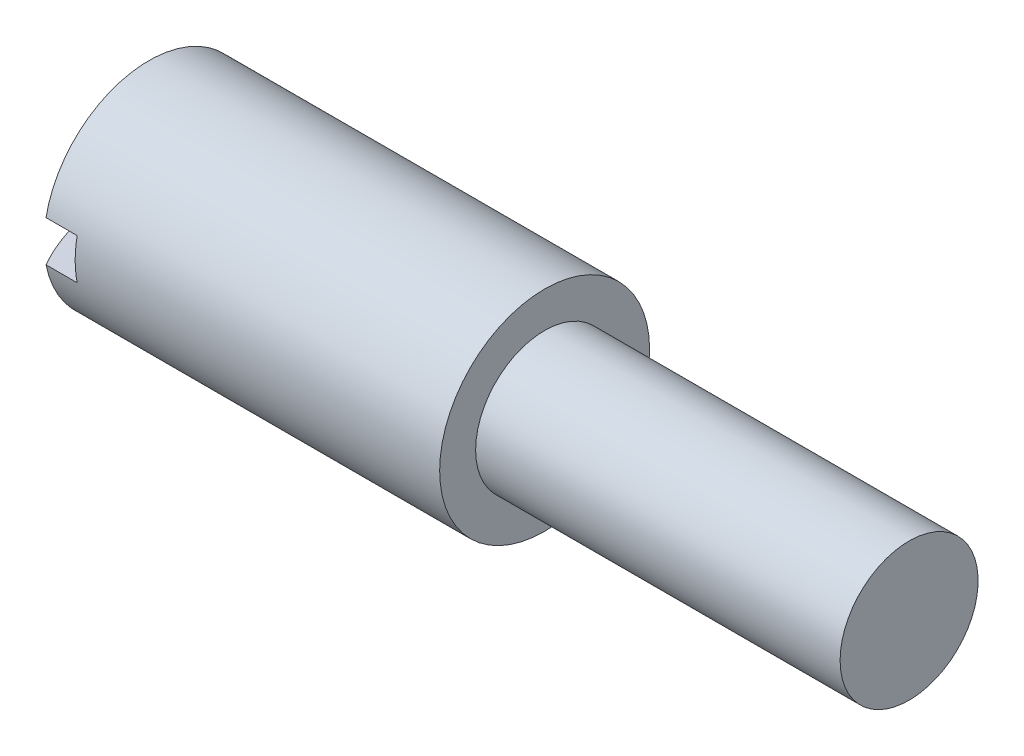
ISO-10303-21;
HEADER;
FILE_DESCRIPTION(('STEP AP214'),'2;1');
FILE_NAME('part.step','',(''),(''),'','','');
FILE_SCHEMA(('AUTOMOTIVE_DESIGN { 1 0 10303 214 1 1 1 1 }'));
ENDSEC;
DATA;
#1=APPLICATION_CONTEXT('core data for automotive mechanical design processes');
#2=APPLICATION_PROTOCOL_DEFINITION('international standard','automotive_design',2000,#1);
#3=PRODUCT_CONTEXT('',#1,'mechanical');
#4=PRODUCT('Part','Part','',(#3));
#5=PRODUCT_RELATED_PRODUCT_CATEGORY('part','',(#4));
#6=PRODUCT_DEFINITION_FORMATION('','',#4);
#7=PRODUCT_DEFINITION_CONTEXT('part definition',#1,'design');
#8=PRODUCT_DEFINITION('design','',#6,#7);
#9=PRODUCT_DEFINITION_SHAPE('','',#8);
#10=(LENGTH_UNIT() NAMED_UNIT(*) SI_UNIT(.MILLI.,.METRE.));
#11=(NAMED_UNIT(*) PLANE_ANGLE_UNIT() SI_UNIT($,.RADIAN.));
#12=(NAMED_UNIT(*) SI_UNIT($,.STERADIAN.) SOLID_ANGLE_UNIT());
#13=UNCERTAINTY_MEASURE_WITH_UNIT(LENGTH_MEASURE(1.E-05),#10,'distance_accuracy_value','');
#14=(GEOMETRIC_REPRESENTATION_CONTEXT(3) GLOBAL_UNCERTAINTY_ASSIGNED_CONTEXT((#13)) GLOBAL_UNIT_ASSIGNED_CONTEXT((#10,
#11,#12)) REPRESENTATION_CONTEXT('',''));
#15=CARTESIAN_POINT('',(0.,0.,0.));
#16=DIRECTION('',(0.,0.,1.));
#17=DIRECTION('',(1.,0.,0.));
#18=AXIS2_PLACEMENT_3D('',#15,#16,#17);
#19=CARTESIAN_POINT('',(5.4864,0.,0.));
#20=DIRECTION('',(-1.,0.,0.));
#21=DIRECTION('',(0.,1.,0.));
#22=AXIS2_PLACEMENT_3D('',#19,#20,#21);
#23=SPHERICAL_SURFACE('',#22,5.4864);
#24=CARTESIAN_POINT('',(5.4864,0.5334,0.));
#25=DIRECTION('',(0.,-1.,0.));
#26=DIRECTION('',(0.,0.,-1.));
#27=AXIS2_PLACEMENT_3D('',#24,#25,#26);
#28=CIRCLE('',#27,5.46040927037525);
#29=CARTESIAN_POINT('',(0.735038224677055,0.5334,2.69084200205066));
#30=VERTEX_POINT('',#29);
#31=CARTESIAN_POINT('',(0.735038224677055,0.5334,-2.69084200205066));
#32=VERTEX_POINT('',#31);
#33=EDGE_CURVE('E99',#30,#32,#28,.T.);
#34=ORIENTED_EDGE('',*,*,#33,.F.);
#35=CARTESIAN_POINT('',(0.735038224677055,0.,0.));
#36=DIRECTION('',(-1.,0.,0.));
#37=DIRECTION('',(0.,0.,1.));
#38=AXIS2_PLACEMENT_3D('',#35,#36,#37);
#39=CIRCLE('',#38,2.7432);
#40=EDGE_CURVE('E89',#30,#32,#39,.T.);
#41=ORIENTED_EDGE('',*,*,#40,.T.);
#42=EDGE_LOOP('',(#34,#41));
#43=FACE_BOUND('',#42,.T.);
#44=ADVANCED_FACE('F32',(#43),#23,.T.);
#45=CARTESIAN_POINT('',(5.4864,-0.5334,0.));
#46=DIRECTION('',(0.,1.,0.));
#47=DIRECTION('',(0.,0.,1.));
#48=AXIS2_PLACEMENT_3D('',#45,#46,#47);
#49=CIRCLE('',#48,5.46040927037525);
#50=CARTESIAN_POINT('',(0.735038224677055,-0.5334,-2.69084200205066));
#51=VERTEX_POINT('',#50);
#52=CARTESIAN_POINT('',(0.735038224677055,-0.5334,2.69084200205066));
#53=VERTEX_POINT('',#52);
#54=EDGE_CURVE('E101',#51,#53,#49,.T.);
#55=ORIENTED_EDGE('',*,*,#54,.F.);
#56=EDGE_CURVE('E96',#51,#53,#39,.T.);
#57=ORIENTED_EDGE('',*,*,#56,.T.);
#58=EDGE_LOOP('',(#55,#57));
#59=FACE_BOUND('',#58,.T.);
#60=ADVANCED_FACE('F114',(#59),#23,.T.);
#61=CARTESIAN_POINT('',(-12.7,0.,0.));
#62=DIRECTION('',(-1.,0.,0.));
#63=DIRECTION('',(0.,0.,1.));
#64=AXIS2_PLACEMENT_3D('',#61,#62,#63);
#65=CYLINDRICAL_SURFACE('',#64,2.7432);
#66=CARTESIAN_POINT('',(11.0744,0.,0.));
#67=DIRECTION('',(-1.,0.,0.));
#68=DIRECTION('',(0.,0.,1.));
#69=AXIS2_PLACEMENT_3D('',#66,#67,#68);
#70=CIRCLE('',#69,2.7432);
#71=CARTESIAN_POINT('',(11.0744,0.,2.7432));
#72=VERTEX_POINT('',#71);
#73=EDGE_CURVE('E35',#72,#72,#70,.F.);
#74=ORIENTED_EDGE('',*,*,#73,.F.);
#75=EDGE_LOOP('',(#74));
#76=FACE_BOUND('',#75,.T.);
#77=ORIENTED_EDGE('',*,*,#40,.F.);
#78=DIRECTION('',(-1.,0.,0.));
#79=VECTOR('',#78,1.);
#80=CARTESIAN_POINT('',(-12.7,0.5334,2.69084200205066));
#81=LINE('',#80,#79);
#82=CARTESIAN_POINT('',(1.5494,0.5334,2.69084200205066));
#83=VERTEX_POINT('',#82);
#84=EDGE_CURVE('E40',#30,#83,#81,.F.);
#85=ORIENTED_EDGE('',*,*,#84,.T.);
#86=CARTESIAN_POINT('',(1.5494,0.,0.));
#87=DIRECTION('',(1.,0.,0.));
#88=DIRECTION('',(0.,0.,-1.));
#89=AXIS2_PLACEMENT_3D('',#86,#87,#88);
#90=CIRCLE('',#89,2.7432);
#91=CARTESIAN_POINT('',(1.5494,-0.5334,2.69084200205066));
#92=VERTEX_POINT('',#91);
#93=EDGE_CURVE('E71',#92,#83,#90,.F.);
#94=ORIENTED_EDGE('',*,*,#93,.F.);
#95=DIRECTION('',(-1.,0.,0.));
#96=VECTOR('',#95,1.);
#97=CARTESIAN_POINT('',(-12.7,-0.5334,2.69084200205066));
#98=LINE('',#97,#96);
#99=EDGE_CURVE('E78',#92,#53,#98,.T.);
#100=ORIENTED_EDGE('',*,*,#99,.T.);
#101=ORIENTED_EDGE('',*,*,#56,.F.);
#102=DIRECTION('',(-1.,0.,0.));
#103=VECTOR('',#102,1.);
#104=CARTESIAN_POINT('',(-12.7,-0.5334,-2.69084200205066));
#105=LINE('',#104,#103);
#106=CARTESIAN_POINT('',(1.5494,-0.5334,-2.69084200205066));
#107=VERTEX_POINT('',#106);
#108=EDGE_CURVE('E93',#51,#107,#105,.F.);
#109=ORIENTED_EDGE('',*,*,#108,.T.);
#110=CARTESIAN_POINT('',(1.5494,0.5334,-2.69084200205066));
#111=VERTEX_POINT('',#110);
#112=EDGE_CURVE('E81',#111,#107,#90,.F.);
#113=ORIENTED_EDGE('',*,*,#112,.F.);
#114=DIRECTION('',(-1.,0.,0.));
#115=VECTOR('',#114,1.);
#116=CARTESIAN_POINT('',(-12.7,0.5334,-2.69084200205066));
#117=LINE('',#116,#115);
#118=EDGE_CURVE('E79',#111,#32,#117,.T.);
#119=ORIENTED_EDGE('',*,*,#118,.T.);
#120=EDGE_LOOP('',(#77,#85,#94,#100,#101,#109,#113,#119));
#121=FACE_BOUND('',#120,.T.);
#122=ADVANCED_FACE('F87',(#76,#121),#65,.T.);
#123=CARTESIAN_POINT('',(1.5494,0.5334,-2.7432));
#124=DIRECTION('',(0.,-1.,0.));
#125=DIRECTION('',(0.,0.,-1.));
#126=AXIS2_PLACEMENT_3D('',#123,#124,#125);
#127=PLANE('',#126);
#128=ORIENTED_EDGE('',*,*,#33,.T.);
#129=ORIENTED_EDGE('',*,*,#118,.F.);
#130=DIRECTION('',(0.,0.,1.));
#131=VECTOR('',#130,1.);
#132=CARTESIAN_POINT('',(1.5494,0.5334,-2.7432));
#133=LINE('',#132,#131);
#134=EDGE_CURVE('E48',#111,#83,#133,.T.);
#135=ORIENTED_EDGE('',*,*,#134,.T.);
#136=ORIENTED_EDGE('',*,*,#84,.F.);
#137=EDGE_LOOP('',(#128,#129,#135,#136));
#138=FACE_BOUND('',#137,.T.);
#139=ADVANCED_FACE('F82',(#138),#127,.T.);
#140=CARTESIAN_POINT('',(1.5494,-0.5334,-2.7432));
#141=DIRECTION('',(0.,1.,0.));
#142=DIRECTION('',(0.,0.,1.));
#143=AXIS2_PLACEMENT_3D('',#140,#141,#142);
#144=PLANE('',#143);
#145=ORIENTED_EDGE('',*,*,#54,.T.);
#146=ORIENTED_EDGE('',*,*,#99,.F.);
#147=DIRECTION('',(0.,0.,-1.));
#148=VECTOR('',#147,1.);
#149=CARTESIAN_POINT('',(1.5494,-0.5334,-2.7432));
#150=LINE('',#149,#148);
#151=EDGE_CURVE('E74',#92,#107,#150,.T.);
#152=ORIENTED_EDGE('',*,*,#151,.T.);
#153=ORIENTED_EDGE('',*,*,#108,.F.);
#154=EDGE_LOOP('',(#145,#146,#152,#153));
#155=FACE_BOUND('',#154,.T.);
#156=ADVANCED_FACE('F119',(#155),#144,.T.);
#157=CARTESIAN_POINT('',(1.5494,0.5334,-2.7432));
#158=DIRECTION('',(1.,0.,0.));
#159=DIRECTION('',(0.,0.,-1.));
#160=AXIS2_PLACEMENT_3D('',#157,#158,#159);
#161=PLANE('',#160);
#162=ORIENTED_EDGE('',*,*,#151,.F.);
#163=ORIENTED_EDGE('',*,*,#93,.T.);
#164=ORIENTED_EDGE('',*,*,#134,.F.);
#165=ORIENTED_EDGE('',*,*,#112,.T.);
#166=EDGE_LOOP('',(#162,#163,#164,#165));
#167=FACE_BOUND('',#166,.T.);
#168=ADVANCED_FACE('F72',(#167),#161,.F.);
#169=CARTESIAN_POINT('',(11.0744,0.,0.));
#170=DIRECTION('',(-1.,0.,0.));
#171=DIRECTION('',(0.,0.,1.));
#172=AXIS2_PLACEMENT_3D('',#169,#170,#171);
#173=PLANE('',#172);
#174=CARTESIAN_POINT('',(11.0744,0.,0.));
#175=DIRECTION('',(1.,0.,0.));
#176=DIRECTION('',(0.,0.,-1.));
#177=AXIS2_PLACEMENT_3D('',#174,#175,#176);
#178=CIRCLE('',#177,1.8034);
#179=CARTESIAN_POINT('',(11.0744,0.,1.8034));
#180=VERTEX_POINT('',#179);
#181=EDGE_CURVE('E11',#180,#180,#178,.T.);
#182=ORIENTED_EDGE('',*,*,#181,.F.);
#183=EDGE_LOOP('',(#182));
#184=FACE_BOUND('',#183,.T.);
#185=ORIENTED_EDGE('',*,*,#73,.T.);
#186=EDGE_LOOP('',(#185));
#187=FACE_BOUND('',#186,.T.);
#188=ADVANCED_FACE('F111',(#184,#187),#173,.F.);
#189=CARTESIAN_POINT('',(20.5994,0.,0.));
#190=DIRECTION('',(-1.,0.,0.));
#191=DIRECTION('',(0.,0.,1.));
#192=AXIS2_PLACEMENT_3D('',#189,#190,#191);
#193=CYLINDRICAL_SURFACE('',#192,1.8034);
#194=CARTESIAN_POINT('',(20.5994,0.,0.));
#195=DIRECTION('',(1.,0.,0.));
#196=DIRECTION('',(0.,0.,-1.));
#197=AXIS2_PLACEMENT_3D('',#194,#195,#196);
#198=CIRCLE('',#197,1.8034);
#199=CARTESIAN_POINT('',(20.5994,0.,1.8034));
#200=VERTEX_POINT('',#199);
#201=EDGE_CURVE('E104',#200,#200,#198,.T.);
#202=CARTESIAN_POINT('',(20.5994,0.,1.8034));
#203=CARTESIAN_POINT('',(20.50018125,0.,1.8034));
#204=CARTESIAN_POINT('',(20.4009625,0.,1.8034));
#205=CARTESIAN_POINT('',(20.202525,0.,1.8034));
#206=CARTESIAN_POINT('',(20.10330625,0.,1.8034));
#207=CARTESIAN_POINT('',(19.90486875,0.,1.8034));
#208=CARTESIAN_POINT('',(19.80565,0.,1.8034));
#209=CARTESIAN_POINT('',(19.6072125,0.,1.8034));
#210=CARTESIAN_POINT('',(19.50799375,0.,1.8034));
#211=CARTESIAN_POINT('',(19.30955625,0.,1.8034));
#212=CARTESIAN_POINT('',(19.2103375,0.,1.8034));
#213=CARTESIAN_POINT('',(19.0119,0.,1.8034));
#214=CARTESIAN_POINT('',(18.91268125,0.,1.8034));
#215=CARTESIAN_POINT('',(18.71424375,0.,1.8034));
#216=CARTESIAN_POINT('',(18.615025,0.,1.8034));
#217=CARTESIAN_POINT('',(18.4165875,0.,1.8034));
#218=CARTESIAN_POINT('',(18.31736875,0.,1.8034));
#219=CARTESIAN_POINT('',(18.11893125,0.,1.8034));
#220=CARTESIAN_POINT('',(18.0197125,0.,1.8034));
#221=CARTESIAN_POINT('',(17.821275,0.,1.8034));
#222=CARTESIAN_POINT('',(17.72205625,0.,1.8034));
#223=CARTESIAN_POINT('',(17.52361875,0.,1.8034));
#224=CARTESIAN_POINT('',(17.4244,0.,1.8034));
#225=CARTESIAN_POINT('',(17.2259625,0.,1.8034));
#226=CARTESIAN_POINT('',(17.12674375,0.,1.8034));
#227=CARTESIAN_POINT('',(16.92830625,0.,1.8034));
#228=CARTESIAN_POINT('',(16.8290875,0.,1.8034));
#229=CARTESIAN_POINT('',(16.63065,0.,1.8034));
#230=CARTESIAN_POINT('',(16.53143125,0.,1.8034));
#231=CARTESIAN_POINT('',(16.33299375,0.,1.8034));
#232=CARTESIAN_POINT('',(16.233775,0.,1.8034));
#233=CARTESIAN_POINT('',(16.0353375,0.,1.8034));
#234=CARTESIAN_POINT('',(15.93611875,0.,1.8034));
#235=CARTESIAN_POINT('',(15.73768125,0.,1.8034));
#236=CARTESIAN_POINT('',(15.6384625,0.,1.8034));
#237=CARTESIAN_POINT('',(15.440025,0.,1.8034));
#238=CARTESIAN_POINT('',(15.34080625,0.,1.8034));
#239=CARTESIAN_POINT('',(15.14236875,0.,1.8034));
#240=CARTESIAN_POINT('',(15.04315,0.,1.8034));
#241=CARTESIAN_POINT('',(14.8447125,0.,1.8034));
#242=CARTESIAN_POINT('',(14.74549375,0.,1.8034));
#243=CARTESIAN_POINT('',(14.54705625,0.,1.8034));
#244=CARTESIAN_POINT('',(14.4478375,0.,1.8034));
#245=CARTESIAN_POINT('',(14.2494,0.,1.8034));
#246=CARTESIAN_POINT('',(14.15018125,0.,1.8034));
#247=CARTESIAN_POINT('',(13.95174375,0.,1.8034));
#248=CARTESIAN_POINT('',(13.852525,0.,1.8034));
#249=CARTESIAN_POINT('',(13.6540875,0.,1.8034));
#250=CARTESIAN_POINT('',(13.55486875,0.,1.8034));
#251=CARTESIAN_POINT('',(13.35643125,0.,1.8034));
#252=CARTESIAN_POINT('',(13.2572125,0.,1.8034));
#253=CARTESIAN_POINT('',(13.058775,0.,1.8034));
#254=CARTESIAN_POINT('',(12.95955625,0.,1.8034));
#255=CARTESIAN_POINT('',(12.76111875,0.,1.8034));
#256=CARTESIAN_POINT('',(12.6619,0.,1.8034));
#257=CARTESIAN_POINT('',(12.4634625,0.,1.8034));
#258=CARTESIAN_POINT('',(12.36424375,0.,1.8034));
#259=CARTESIAN_POINT('',(12.16580625,0.,1.8034));
#260=CARTESIAN_POINT('',(12.0665875,0.,1.8034));
#261=CARTESIAN_POINT('',(11.86815,0.,1.8034));
#262=CARTESIAN_POINT('',(11.76893125,0.,1.8034));
#263=CARTESIAN_POINT('',(11.57049375,0.,1.8034));
#264=CARTESIAN_POINT('',(11.471275,0.,1.8034));
#265=CARTESIAN_POINT('',(11.2728375,0.,1.8034));
#266=CARTESIAN_POINT('',(11.17361875,0.,1.8034));
#267=CARTESIAN_POINT('',(11.0744,0.,1.8034));
#268=B_SPLINE_CURVE_WITH_KNOTS('',3,(#202,#203,#204,#205,#206,#207,#208,#209,#210,#211,#212,
#213,#214,#215,#216,#217,#218,#219,#220,#221,#222,#223,#224,#225,#226,#227,#228,#229,#230,#231,
#232,#233,#234,#235,#236,#237,#238,#239,#240,#241,#242,#243,#244,#245,#246,#247,#248,#249,#250,
#251,#252,#253,#254,#255,#256,#257,#258,#259,#260,#261,#262,#263,#264,#265,#266,#267),
.UNSPECIFIED.,.F.,.F.,(4,2,2,2,2,2,2,2,2,2,2,2,2,2,2,2,2,2,2,2,2,2,2,2,2,2,2,2,2,2,2,2,4),(0.,
0.297656249999997,0.595312499999997,0.892968749999997,1.190625,1.48828125,1.7859375,2.08359375,
2.38125,2.67890625,2.9765625,3.27421875,3.571875,3.86953125,4.1671875,4.46484375,4.7625,
5.06015625,5.3578125,5.65546875,5.953125,6.25078125,6.5484375,6.84609375,7.14375,7.44140625,
7.7390625,8.03671875,8.334375,8.63203125,8.9296875,9.22734375,9.525),.UNSPECIFIED.);
#269=EDGE_CURVE('BSEAM138',#200,#180,#268,.T.);
#270=ORIENTED_EDGE('',*,*,#201,.F.);
#271=ORIENTED_EDGE('',*,*,#181,.T.);
#272=ORIENTED_EDGE('',*,*,#269,.T.);
#273=ORIENTED_EDGE('',*,*,#269,.F.);
#274=EDGE_LOOP('',(#270,#272,#271,#273));
#275=FACE_BOUND('',#274,.T.);
#276=ADVANCED_FACE('F138',(#275),#193,.T.);
#277=CARTESIAN_POINT('',(20.5994,0.,0.));
#278=DIRECTION('',(1.,0.,0.));
#279=DIRECTION('',(0.,0.,-1.));
#280=AXIS2_PLACEMENT_3D('',#277,#278,#279);
#281=PLANE('',#280);
#282=ORIENTED_EDGE('',*,*,#201,.T.);
#283=EDGE_LOOP('',(#282));
#284=FACE_BOUND('',#283,.T.);
#285=ADVANCED_FACE('F142',(#284),#281,.T.);
#286=CLOSED_SHELL('',(#44,#60,#122,#139,#156,#168,#188,#276,#285));
#287=MANIFOLD_SOLID_BREP('B2',#286);
#288=ADVANCED_BREP_SHAPE_REPRESENTATION('',(#18,#287),#14);
#289=SHAPE_DEFINITION_REPRESENTATION(#9,#288);
ENDSEC;
END-ISO-10303-21;
